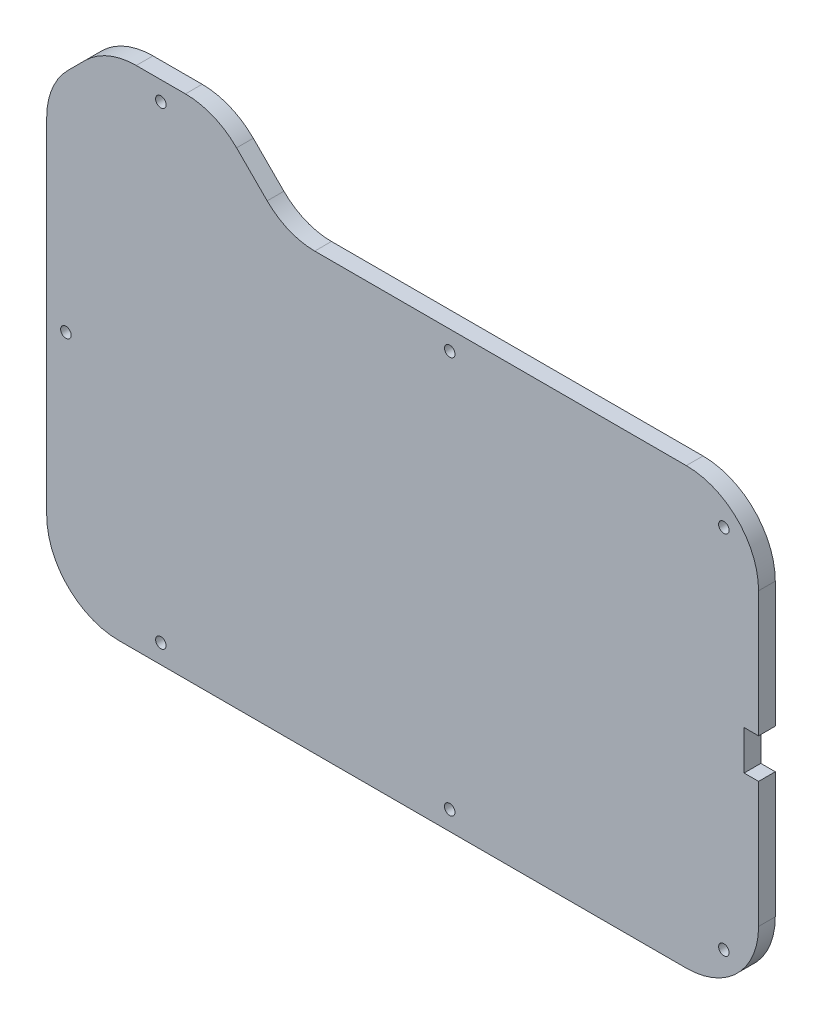
ISO-10303-21;
HEADER;
FILE_DESCRIPTION(('STEP AP214'),'2;1');
FILE_NAME('part.step','',(''),(''),'','','');
FILE_SCHEMA(('AUTOMOTIVE_DESIGN { 1 0 10303 214 1 1 1 1 }'));
ENDSEC;
DATA;
#1=APPLICATION_CONTEXT('core data for automotive mechanical design processes');
#2=APPLICATION_PROTOCOL_DEFINITION('international standard','automotive_design',2000,#1);
#3=PRODUCT_CONTEXT('',#1,'mechanical');
#4=PRODUCT('Part','Part','',(#3));
#5=PRODUCT_RELATED_PRODUCT_CATEGORY('part','',(#4));
#6=PRODUCT_DEFINITION_FORMATION('','',#4);
#7=PRODUCT_DEFINITION_CONTEXT('part definition',#1,'design');
#8=PRODUCT_DEFINITION('design','',#6,#7);
#9=PRODUCT_DEFINITION_SHAPE('','',#8);
#10=(LENGTH_UNIT() NAMED_UNIT(*) SI_UNIT(.MILLI.,.METRE.));
#11=(NAMED_UNIT(*) PLANE_ANGLE_UNIT() SI_UNIT($,.RADIAN.));
#12=(NAMED_UNIT(*) SI_UNIT($,.STERADIAN.) SOLID_ANGLE_UNIT());
#13=UNCERTAINTY_MEASURE_WITH_UNIT(LENGTH_MEASURE(1.E-05),#10,'distance_accuracy_value','');
#14=(GEOMETRIC_REPRESENTATION_CONTEXT(3) GLOBAL_UNCERTAINTY_ASSIGNED_CONTEXT((#13)) GLOBAL_UNIT_ASSIGNED_CONTEXT((#10,
#11,#12)) REPRESENTATION_CONTEXT('',''));
#15=CARTESIAN_POINT('',(0.,0.,0.));
#16=DIRECTION('',(0.,0.,1.));
#17=DIRECTION('',(1.,0.,0.));
#18=AXIS2_PLACEMENT_3D('',#15,#16,#17);
#19=CARTESIAN_POINT('',(130.058069079206,20.4605017386257,3.175));
#20=DIRECTION('',(0.,0.,1.));
#21=DIRECTION('',(1.,0.,0.));
#22=AXIS2_PLACEMENT_3D('',#19,#20,#21);
#23=PLANE('',#22);
#24=CARTESIAN_POINT('',(85.0537427985491,10.3605017396949,3.175));
#25=DIRECTION('',(0.,0.,1.));
#26=DIRECTION('',(1.,0.,0.));
#27=AXIS2_PLACEMENT_3D('',#24,#25,#26);
#28=CIRCLE('',#27,0.999999999999998);
#29=CARTESIAN_POINT('',(86.0537427985491,10.3605017396949,3.175));
#30=VERTEX_POINT('',#29);
#31=EDGE_CURVE('E383',#30,#30,#28,.T.);
#32=ORIENTED_EDGE('',*,*,#31,.F.);
#33=EDGE_LOOP('',(#32));
#34=FACE_BOUND('',#33,.T.);
#35=CARTESIAN_POINT('',(137.199847569466,82.9022802294033,3.175));
#36=DIRECTION('',(0.,0.,1.));
#37=DIRECTION('',(1.,0.,0.));
#38=AXIS2_PLACEMENT_3D('',#35,#36,#37);
#39=CIRCLE('',#38,0.999999999817027);
#40=CARTESIAN_POINT('',(138.199847569283,82.9022802294033,3.175));
#41=VERTEX_POINT('',#40);
#42=EDGE_CURVE('E395',#41,#41,#39,.T.);
#43=ORIENTED_EDGE('',*,*,#42,.F.);
#44=EDGE_LOOP('',(#43));
#45=FACE_BOUND('',#44,.T.);
#46=CARTESIAN_POINT('',(30.0963119397805,99.4605017396949,3.175));
#47=DIRECTION('',(0.,0.,1.));
#48=DIRECTION('',(1.,0.,0.));
#49=AXIS2_PLACEMENT_3D('',#46,#47,#48);
#50=CIRCLE('',#49,0.999999999999998);
#51=CARTESIAN_POINT('',(31.0963119397805,99.4605017396949,3.175));
#52=VERTEX_POINT('',#51);
#53=EDGE_CURVE('E407',#52,#52,#50,.T.);
#54=ORIENTED_EDGE('',*,*,#53,.F.);
#55=EDGE_LOOP('',(#54));
#56=FACE_BOUND('',#55,.T.);
#57=CARTESIAN_POINT('',(130.058069079206,20.4605017386257,3.175));
#58=DIRECTION('',(0.,0.,1.));
#59=DIRECTION('',(1.,0.,0.));
#60=AXIS2_PLACEMENT_3D('',#57,#58,#59);
#61=CIRCLE('',#60,13.75);
#62=CARTESIAN_POINT('',(130.058069079206,6.71050173862571,3.175));
#63=VERTEX_POINT('',#62);
#64=CARTESIAN_POINT('',(143.808069079206,20.4605017386257,3.175));
#65=VERTEX_POINT('',#64);
#66=EDGE_CURVE('E227',#63,#65,#61,.T.);
#67=ORIENTED_EDGE('',*,*,#66,.T.);
#68=DIRECTION('',(0.,1.,0.));
#69=VECTOR('',#68,1.);
#70=CARTESIAN_POINT('',(143.808069079206,20.4605017386257,3.175));
#71=LINE('',#70,#69);
#72=CARTESIAN_POINT('',(143.808069079206,44.3605017391603,3.175));
#73=VERTEX_POINT('',#72);
#74=EDGE_CURVE('E125',#65,#73,#71,.T.);
#75=ORIENTED_EDGE('',*,*,#74,.T.);
#76=DIRECTION('',(-1.,0.,0.));
#77=VECTOR('',#76,1.);
#78=CARTESIAN_POINT('',(141.058069079206,44.3605017391603,3.175));
#79=LINE('',#78,#77);
#80=CARTESIAN_POINT('',(141.058069079206,44.3605017391603,3.175));
#81=VERTEX_POINT('',#80);
#82=EDGE_CURVE('E272',#73,#81,#79,.T.);
#83=ORIENTED_EDGE('',*,*,#82,.T.);
#84=DIRECTION('',(0.,1.,0.));
#85=VECTOR('',#84,1.);
#86=CARTESIAN_POINT('',(141.058069079206,44.3605017391603,3.175));
#87=LINE('',#86,#85);
#88=CARTESIAN_POINT('',(141.058069079206,51.8605017391603,3.175));
#89=VERTEX_POINT('',#88);
#90=EDGE_CURVE('E291',#81,#89,#87,.T.);
#91=ORIENTED_EDGE('',*,*,#90,.T.);
#92=DIRECTION('',(1.,0.,0.));
#93=VECTOR('',#92,1.);
#94=CARTESIAN_POINT('',(141.058069079206,51.8605017391603,3.175));
#95=LINE('',#94,#93);
#96=CARTESIAN_POINT('',(143.808069079206,51.8605017391603,3.175));
#97=VERTEX_POINT('',#96);
#98=EDGE_CURVE('E288',#89,#97,#95,.T.);
#99=ORIENTED_EDGE('',*,*,#98,.T.);
#100=DIRECTION('',(0.,1.,0.));
#101=VECTOR('',#100,1.);
#102=CARTESIAN_POINT('',(143.808069079206,51.8605017391603,3.175));
#103=LINE('',#102,#101);
#104=CARTESIAN_POINT('',(143.808069079206,75.7605017396949,3.175));
#105=VERTEX_POINT('',#104);
#106=EDGE_CURVE('E290',#97,#105,#103,.T.);
#107=ORIENTED_EDGE('',*,*,#106,.T.);
#108=CARTESIAN_POINT('',(130.058069079206,75.7605017396949,3.175));
#109=DIRECTION('',(0.,0.,1.));
#110=DIRECTION('',(1.,0.,0.));
#111=AXIS2_PLACEMENT_3D('',#108,#109,#110);
#112=CIRCLE('',#111,13.75);
#113=CARTESIAN_POINT('',(130.058069079206,89.5105017396949,3.175));
#114=VERTEX_POINT('',#113);
#115=EDGE_CURVE('E293',#105,#114,#112,.T.);
#116=ORIENTED_EDGE('',*,*,#115,.T.);
#117=DIRECTION('',(-1.,0.,0.));
#118=VECTOR('',#117,1.);
#119=CARTESIAN_POINT('',(130.058069079206,89.5105017396948,3.175));
#120=LINE('',#119,#118);
#121=CARTESIAN_POINT('',(59.3751830391429,89.5105017396948,3.175));
#122=VERTEX_POINT('',#121);
#123=EDGE_CURVE('E299',#114,#122,#120,.T.);
#124=ORIENTED_EDGE('',*,*,#123,.T.);
#125=CARTESIAN_POINT('',(59.3751830391429,102.310501739695,3.175));
#126=DIRECTION('',(0.,0.,-1.));
#127=DIRECTION('',(1.,0.,0.));
#128=AXIS2_PLACEMENT_3D('',#125,#126,#127);
#129=CIRCLE('',#128,12.8);
#130=CARTESIAN_POINT('',(50.3242162399551,93.2595349405071,3.175));
#131=VERTEX_POINT('',#130);
#132=EDGE_CURVE('E301',#122,#131,#129,.T.);
#133=ORIENTED_EDGE('',*,*,#132,.T.);
#134=DIRECTION('',(-0.707106781186548,0.707106781186548,0.));
#135=VECTOR('',#134,1.);
#136=CARTESIAN_POINT('',(50.3242162399551,93.2595349405071,3.175));
#137=LINE('',#136,#135);
#138=CARTESIAN_POINT('',(44.5005311994522,99.0832199810099,3.175));
#139=VERTEX_POINT('',#138);
#140=EDGE_CURVE('E303',#131,#139,#137,.T.);
#141=ORIENTED_EDGE('',*,*,#140,.T.);
#142=CARTESIAN_POINT('',(34.7778129581372,89.3605017396949,3.175));
#143=DIRECTION('',(0.,0.,1.));
#144=DIRECTION('',(1.,0.,0.));
#145=AXIS2_PLACEMENT_3D('',#142,#143,#144);
#146=CIRCLE('',#145,13.75);
#147=CARTESIAN_POINT('',(34.7778129581371,103.110501739695,3.175));
#148=VERTEX_POINT('',#147);
#149=EDGE_CURVE('E305',#139,#148,#146,.T.);
#150=ORIENTED_EDGE('',*,*,#149,.T.);
#151=DIRECTION('',(-1.,0.,0.));
#152=VECTOR('',#151,1.);
#153=CARTESIAN_POINT('',(34.7778129581371,103.110501739695,3.175));
#154=LINE('',#153,#152);
#155=CARTESIAN_POINT('',(25.4148109214239,103.110501739695,3.175));
#156=VERTEX_POINT('',#155);
#157=EDGE_CURVE('E307',#148,#156,#154,.T.);
#158=ORIENTED_EDGE('',*,*,#157,.T.);
#159=CARTESIAN_POINT('',(25.4148109214239,89.3605017396949,3.175));
#160=DIRECTION('',(0.,0.,1.));
#161=DIRECTION('',(1.,0.,0.));
#162=AXIS2_PLACEMENT_3D('',#159,#160,#161);
#163=CIRCLE('',#162,13.75);
#164=CARTESIAN_POINT('',(15.6920926801088,99.0832199810099,3.175));
#165=VERTEX_POINT('',#164);
#166=EDGE_CURVE('E309',#156,#165,#163,.T.);
#167=ORIENTED_EDGE('',*,*,#166,.T.);
#168=DIRECTION('',(-0.707106781186548,-0.707106781186548,0.));
#169=VECTOR('',#168,1.);
#170=CARTESIAN_POINT('',(15.6920926801088,99.0832199810099,3.175));
#171=LINE('',#170,#169);
#172=CARTESIAN_POINT('',(12.4118365590397,95.8029638599407,3.175));
#173=VERTEX_POINT('',#172);
#174=EDGE_CURVE('E311',#165,#173,#171,.T.);
#175=ORIENTED_EDGE('',*,*,#174,.T.);
#176=CARTESIAN_POINT('',(22.1345548003547,86.0802456186257,3.175));
#177=DIRECTION('',(0.,0.,1.));
#178=DIRECTION('',(1.,0.,0.));
#179=AXIS2_PLACEMENT_3D('',#176,#177,#178);
#180=CIRCLE('',#179,13.75);
#181=CARTESIAN_POINT('',(8.38455480035474,86.0802456186257,3.175));
#182=VERTEX_POINT('',#181);
#183=EDGE_CURVE('E174',#173,#182,#180,.T.);
#184=ORIENTED_EDGE('',*,*,#183,.T.);
#185=DIRECTION('',(0.,-1.,0.));
#186=VECTOR('',#185,1.);
#187=CARTESIAN_POINT('',(8.38455480035474,86.0802456186257,3.175));
#188=LINE('',#187,#186);
#189=CARTESIAN_POINT('',(8.38455480035472,20.4605017386257,3.175));
#190=VERTEX_POINT('',#189);
#191=EDGE_CURVE('E168',#182,#190,#188,.T.);
#192=ORIENTED_EDGE('',*,*,#191,.T.);
#193=CARTESIAN_POINT('',(22.1345548003547,20.4605017386257,3.175));
#194=DIRECTION('',(0.,0.,1.));
#195=DIRECTION('',(1.,0.,0.));
#196=AXIS2_PLACEMENT_3D('',#193,#194,#195);
#197=CIRCLE('',#196,13.75);
#198=CARTESIAN_POINT('',(22.1345548003547,6.7105017386257,3.175));
#199=VERTEX_POINT('',#198);
#200=EDGE_CURVE('E172',#190,#199,#197,.T.);
#201=ORIENTED_EDGE('',*,*,#200,.T.);
#202=DIRECTION('',(1.,0.,0.));
#203=VECTOR('',#202,1.);
#204=CARTESIAN_POINT('',(22.1345548003547,6.71050173862571,3.175));
#205=LINE('',#204,#203);
#206=EDGE_CURVE('E52',#199,#63,#205,.T.);
#207=ORIENTED_EDGE('',*,*,#206,.T.);
#208=EDGE_LOOP('',(#67,#75,#83,#91,#99,#107,#116,#124,#133,#141,#150,#158,#167,#175,#184,#192,
#201,#207));
#209=FACE_BOUND('',#208,.T.);
#210=CARTESIAN_POINT('',(12.0345548003547,52.4703736791603,3.175));
#211=DIRECTION('',(0.,0.,1.));
#212=DIRECTION('',(1.,0.,0.));
#213=AXIS2_PLACEMENT_3D('',#210,#211,#212);
#214=CIRCLE('',#213,0.999999999999998);
#215=CARTESIAN_POINT('',(13.0345548003547,52.4703736791603,3.175));
#216=VERTEX_POINT('',#215);
#217=EDGE_CURVE('E196',#216,#216,#214,.T.);
#218=ORIENTED_EDGE('',*,*,#217,.F.);
#219=EDGE_LOOP('',(#218));
#220=FACE_BOUND('',#219,.T.);
#221=CARTESIAN_POINT('',(85.0537427985491,85.8605017396949,3.175));
#222=DIRECTION('',(0.,0.,1.));
#223=DIRECTION('',(1.,0.,0.));
#224=AXIS2_PLACEMENT_3D('',#221,#222,#223);
#225=CIRCLE('',#224,0.999999999999998);
#226=CARTESIAN_POINT('',(86.0537427985491,85.8605017396949,3.175));
#227=VERTEX_POINT('',#226);
#228=EDGE_CURVE('E401',#227,#227,#225,.T.);
#229=ORIENTED_EDGE('',*,*,#228,.F.);
#230=EDGE_LOOP('',(#229));
#231=FACE_BOUND('',#230,.T.);
#232=CARTESIAN_POINT('',(137.199847569458,13.3187232494434,3.175));
#233=DIRECTION('',(0.,0.,1.));
#234=DIRECTION('',(1.,0.,0.));
#235=AXIS2_PLACEMENT_3D('',#232,#233,#234);
#236=CIRCLE('',#235,0.999999999822488);
#237=CARTESIAN_POINT('',(138.19984756928,13.3187232494434,3.175));
#238=VERTEX_POINT('',#237);
#239=EDGE_CURVE('E389',#238,#238,#236,.T.);
#240=ORIENTED_EDGE('',*,*,#239,.F.);
#241=EDGE_LOOP('',(#240));
#242=FACE_BOUND('',#241,.T.);
#243=CARTESIAN_POINT('',(30.0963119397805,10.3605017396949,3.175));
#244=DIRECTION('',(0.,0.,1.));
#245=DIRECTION('',(1.,0.,0.));
#246=AXIS2_PLACEMENT_3D('',#243,#244,#245);
#247=CIRCLE('',#246,0.999999999999998);
#248=CARTESIAN_POINT('',(31.0963119397805,10.3605017396949,3.175));
#249=VERTEX_POINT('',#248);
#250=EDGE_CURVE('E374',#249,#249,#247,.T.);
#251=ORIENTED_EDGE('',*,*,#250,.F.);
#252=EDGE_LOOP('',(#251));
#253=FACE_BOUND('',#252,.T.);
#254=ADVANCED_FACE('F35',(#34,#45,#56,#209,#220,#231,#242,#253),#23,.T.);
#255=CARTESIAN_POINT('',(130.058069079206,20.4605017386257,0.));
#256=DIRECTION('',(0.,0.,1.));
#257=DIRECTION('',(1.,0.,0.));
#258=AXIS2_PLACEMENT_3D('',#255,#256,#257);
#259=PLANE('',#258);
#260=CARTESIAN_POINT('',(130.058069079206,20.4605017386257,0.));
#261=DIRECTION('',(0.,0.,1.));
#262=DIRECTION('',(1.,0.,0.));
#263=AXIS2_PLACEMENT_3D('',#260,#261,#262);
#264=CIRCLE('',#263,13.75);
#265=CARTESIAN_POINT('',(130.058069079206,6.71050173862571,0.));
#266=VERTEX_POINT('',#265);
#267=CARTESIAN_POINT('',(143.808069079206,20.4605017386257,0.));
#268=VERTEX_POINT('',#267);
#269=EDGE_CURVE('E192',#266,#268,#264,.T.);
#270=ORIENTED_EDGE('',*,*,#269,.F.);
#271=DIRECTION('',(1.,0.,0.));
#272=VECTOR('',#271,1.);
#273=CARTESIAN_POINT('',(22.1345548003547,6.71050173862571,0.));
#274=LINE('',#273,#272);
#275=CARTESIAN_POINT('',(22.1345548003547,6.7105017386257,0.));
#276=VERTEX_POINT('',#275);
#277=EDGE_CURVE('E117',#276,#266,#274,.T.);
#278=ORIENTED_EDGE('',*,*,#277,.F.);
#279=CARTESIAN_POINT('',(22.1345548003547,20.4605017386257,0.));
#280=DIRECTION('',(0.,0.,1.));
#281=DIRECTION('',(1.,0.,0.));
#282=AXIS2_PLACEMENT_3D('',#279,#280,#281);
#283=CIRCLE('',#282,13.75);
#284=CARTESIAN_POINT('',(8.38455480035472,20.4605017386257,0.));
#285=VERTEX_POINT('',#284);
#286=EDGE_CURVE('E111',#285,#276,#283,.T.);
#287=ORIENTED_EDGE('',*,*,#286,.F.);
#288=DIRECTION('',(0.,-1.,0.));
#289=VECTOR('',#288,1.);
#290=CARTESIAN_POINT('',(8.38455480035474,86.0802456186257,0.));
#291=LINE('',#290,#289);
#292=CARTESIAN_POINT('',(8.38455480035474,86.0802456186257,0.));
#293=VERTEX_POINT('',#292);
#294=EDGE_CURVE('E182',#293,#285,#291,.T.);
#295=ORIENTED_EDGE('',*,*,#294,.F.);
#296=CARTESIAN_POINT('',(22.1345548003547,86.0802456186257,0.));
#297=DIRECTION('',(0.,0.,1.));
#298=DIRECTION('',(1.,0.,0.));
#299=AXIS2_PLACEMENT_3D('',#296,#297,#298);
#300=CIRCLE('',#299,13.75);
#301=CARTESIAN_POINT('',(12.4118365590397,95.8029638599407,0.));
#302=VERTEX_POINT('',#301);
#303=EDGE_CURVE('E222',#302,#293,#300,.T.);
#304=ORIENTED_EDGE('',*,*,#303,.F.);
#305=DIRECTION('',(-0.707106781186548,-0.707106781186548,0.));
#306=VECTOR('',#305,1.);
#307=CARTESIAN_POINT('',(15.6920926801088,99.0832199810099,0.));
#308=LINE('',#307,#306);
#309=CARTESIAN_POINT('',(15.6920926801088,99.0832199810099,0.));
#310=VERTEX_POINT('',#309);
#311=EDGE_CURVE('E220',#310,#302,#308,.T.);
#312=ORIENTED_EDGE('',*,*,#311,.F.);
#313=CARTESIAN_POINT('',(25.4148109214239,89.3605017396949,0.));
#314=DIRECTION('',(0.,0.,1.));
#315=DIRECTION('',(1.,0.,0.));
#316=AXIS2_PLACEMENT_3D('',#313,#314,#315);
#317=CIRCLE('',#316,13.75);
#318=CARTESIAN_POINT('',(25.4148109214239,103.110501739695,0.));
#319=VERTEX_POINT('',#318);
#320=EDGE_CURVE('E218',#319,#310,#317,.T.);
#321=ORIENTED_EDGE('',*,*,#320,.F.);
#322=DIRECTION('',(-1.,0.,0.));
#323=VECTOR('',#322,1.);
#324=CARTESIAN_POINT('',(34.7778129581371,103.110501739695,0.));
#325=LINE('',#324,#323);
#326=CARTESIAN_POINT('',(34.7778129581371,103.110501739695,0.));
#327=VERTEX_POINT('',#326);
#328=EDGE_CURVE('E216',#327,#319,#325,.T.);
#329=ORIENTED_EDGE('',*,*,#328,.F.);
#330=CARTESIAN_POINT('',(34.7778129581372,89.3605017396949,0.));
#331=DIRECTION('',(0.,0.,1.));
#332=DIRECTION('',(1.,0.,0.));
#333=AXIS2_PLACEMENT_3D('',#330,#331,#332);
#334=CIRCLE('',#333,13.75);
#335=CARTESIAN_POINT('',(44.5005311994522,99.0832199810099,0.));
#336=VERTEX_POINT('',#335);
#337=EDGE_CURVE('E214',#336,#327,#334,.T.);
#338=ORIENTED_EDGE('',*,*,#337,.F.);
#339=DIRECTION('',(-0.707106781186548,0.707106781186548,0.));
#340=VECTOR('',#339,1.);
#341=CARTESIAN_POINT('',(50.3242162399551,93.2595349405071,0.));
#342=LINE('',#341,#340);
#343=CARTESIAN_POINT('',(50.3242162399551,93.2595349405071,0.));
#344=VERTEX_POINT('',#343);
#345=EDGE_CURVE('E212',#344,#336,#342,.T.);
#346=ORIENTED_EDGE('',*,*,#345,.F.);
#347=CARTESIAN_POINT('',(59.3751830391429,102.310501739695,0.));
#348=DIRECTION('',(0.,0.,-1.));
#349=DIRECTION('',(1.,0.,0.));
#350=AXIS2_PLACEMENT_3D('',#347,#348,#349);
#351=CIRCLE('',#350,12.8);
#352=CARTESIAN_POINT('',(59.3751830391429,89.5105017396948,0.));
#353=VERTEX_POINT('',#352);
#354=EDGE_CURVE('E210',#353,#344,#351,.T.);
#355=ORIENTED_EDGE('',*,*,#354,.F.);
#356=DIRECTION('',(-1.,0.,0.));
#357=VECTOR('',#356,1.);
#358=CARTESIAN_POINT('',(130.058069079206,89.5105017396948,0.));
#359=LINE('',#358,#357);
#360=CARTESIAN_POINT('',(130.058069079206,89.5105017396949,0.));
#361=VERTEX_POINT('',#360);
#362=EDGE_CURVE('E208',#361,#353,#359,.T.);
#363=ORIENTED_EDGE('',*,*,#362,.F.);
#364=CARTESIAN_POINT('',(130.058069079206,75.7605017396949,0.));
#365=DIRECTION('',(0.,0.,1.));
#366=DIRECTION('',(1.,0.,0.));
#367=AXIS2_PLACEMENT_3D('',#364,#365,#366);
#368=CIRCLE('',#367,13.75);
#369=CARTESIAN_POINT('',(143.808069079206,75.7605017396949,0.));
#370=VERTEX_POINT('',#369);
#371=EDGE_CURVE('E206',#370,#361,#368,.T.);
#372=ORIENTED_EDGE('',*,*,#371,.F.);
#373=DIRECTION('',(0.,1.,0.));
#374=VECTOR('',#373,1.);
#375=CARTESIAN_POINT('',(143.808069079206,51.8605017391603,0.));
#376=LINE('',#375,#374);
#377=CARTESIAN_POINT('',(143.808069079206,51.8605017391603,0.));
#378=VERTEX_POINT('',#377);
#379=EDGE_CURVE('E204',#378,#370,#376,.T.);
#380=ORIENTED_EDGE('',*,*,#379,.F.);
#381=DIRECTION('',(1.,0.,0.));
#382=VECTOR('',#381,1.);
#383=CARTESIAN_POINT('',(141.058069079206,51.8605017391603,0.));
#384=LINE('',#383,#382);
#385=CARTESIAN_POINT('',(141.058069079206,51.8605017391603,0.));
#386=VERTEX_POINT('',#385);
#387=EDGE_CURVE('E202',#386,#378,#384,.T.);
#388=ORIENTED_EDGE('',*,*,#387,.F.);
#389=DIRECTION('',(0.,1.,0.));
#390=VECTOR('',#389,1.);
#391=CARTESIAN_POINT('',(141.058069079206,44.3605017391603,0.));
#392=LINE('',#391,#390);
#393=CARTESIAN_POINT('',(141.058069079206,44.3605017391603,0.));
#394=VERTEX_POINT('',#393);
#395=EDGE_CURVE('E200',#394,#386,#392,.T.);
#396=ORIENTED_EDGE('',*,*,#395,.F.);
#397=DIRECTION('',(-1.,0.,0.));
#398=VECTOR('',#397,1.);
#399=CARTESIAN_POINT('',(141.058069079206,44.3605017391603,0.));
#400=LINE('',#399,#398);
#401=CARTESIAN_POINT('',(143.808069079206,44.3605017391603,0.));
#402=VERTEX_POINT('',#401);
#403=EDGE_CURVE('E198',#402,#394,#400,.T.);
#404=ORIENTED_EDGE('',*,*,#403,.F.);
#405=DIRECTION('',(0.,1.,0.));
#406=VECTOR('',#405,1.);
#407=CARTESIAN_POINT('',(143.808069079206,20.4605017386257,0.));
#408=LINE('',#407,#406);
#409=EDGE_CURVE('E195',#268,#402,#408,.T.);
#410=ORIENTED_EDGE('',*,*,#409,.F.);
#411=EDGE_LOOP('',(#270,#278,#287,#295,#304,#312,#321,#329,#338,#346,#355,#363,#372,#380,#388,
#396,#404,#410));
#412=FACE_BOUND('',#411,.T.);
#413=CARTESIAN_POINT('',(12.0345548003547,52.4703736791603,0.));
#414=DIRECTION('',(0.,0.,1.));
#415=DIRECTION('',(1.,0.,0.));
#416=AXIS2_PLACEMENT_3D('',#413,#414,#415);
#417=CIRCLE('',#416,0.999999999999998);
#418=CARTESIAN_POINT('',(13.0345548003547,52.4703736791603,0.));
#419=VERTEX_POINT('',#418);
#420=EDGE_CURVE('E410',#419,#419,#417,.T.);
#421=ORIENTED_EDGE('',*,*,#420,.T.);
#422=EDGE_LOOP('',(#421));
#423=FACE_BOUND('',#422,.T.);
#424=CARTESIAN_POINT('',(30.0963119397805,99.4605017396949,0.));
#425=DIRECTION('',(0.,0.,1.));
#426=DIRECTION('',(1.,0.,0.));
#427=AXIS2_PLACEMENT_3D('',#424,#425,#426);
#428=CIRCLE('',#427,0.999999999999998);
#429=CARTESIAN_POINT('',(31.0963119397805,99.4605017396949,0.));
#430=VERTEX_POINT('',#429);
#431=EDGE_CURVE('E404',#430,#430,#428,.T.);
#432=ORIENTED_EDGE('',*,*,#431,.T.);
#433=EDGE_LOOP('',(#432));
#434=FACE_BOUND('',#433,.T.);
#435=CARTESIAN_POINT('',(85.0537427985491,85.8605017396949,0.));
#436=DIRECTION('',(0.,0.,1.));
#437=DIRECTION('',(1.,0.,0.));
#438=AXIS2_PLACEMENT_3D('',#435,#436,#437);
#439=CIRCLE('',#438,0.999999999999998);
#440=CARTESIAN_POINT('',(86.0537427985491,85.8605017396949,0.));
#441=VERTEX_POINT('',#440);
#442=EDGE_CURVE('E398',#441,#441,#439,.T.);
#443=ORIENTED_EDGE('',*,*,#442,.T.);
#444=EDGE_LOOP('',(#443));
#445=FACE_BOUND('',#444,.T.);
#446=CARTESIAN_POINT('',(137.199847569466,82.9022802294033,0.));
#447=DIRECTION('',(0.,0.,1.));
#448=DIRECTION('',(1.,0.,0.));
#449=AXIS2_PLACEMENT_3D('',#446,#447,#448);
#450=CIRCLE('',#449,0.999999999817027);
#451=CARTESIAN_POINT('',(138.199847569283,82.9022802294033,0.));
#452=VERTEX_POINT('',#451);
#453=EDGE_CURVE('E392',#452,#452,#450,.T.);
#454=ORIENTED_EDGE('',*,*,#453,.T.);
#455=EDGE_LOOP('',(#454));
#456=FACE_BOUND('',#455,.T.);
#457=CARTESIAN_POINT('',(137.199847569458,13.3187232494434,0.));
#458=DIRECTION('',(0.,0.,1.));
#459=DIRECTION('',(1.,0.,0.));
#460=AXIS2_PLACEMENT_3D('',#457,#458,#459);
#461=CIRCLE('',#460,0.999999999822488);
#462=CARTESIAN_POINT('',(138.19984756928,13.3187232494434,0.));
#463=VERTEX_POINT('',#462);
#464=EDGE_CURVE('E386',#463,#463,#461,.T.);
#465=ORIENTED_EDGE('',*,*,#464,.T.);
#466=EDGE_LOOP('',(#465));
#467=FACE_BOUND('',#466,.T.);
#468=CARTESIAN_POINT('',(85.0537427985491,10.3605017396949,0.));
#469=DIRECTION('',(0.,0.,1.));
#470=DIRECTION('',(1.,0.,0.));
#471=AXIS2_PLACEMENT_3D('',#468,#469,#470);
#472=CIRCLE('',#471,0.999999999999998);
#473=CARTESIAN_POINT('',(86.0537427985491,10.3605017396949,0.));
#474=VERTEX_POINT('',#473);
#475=EDGE_CURVE('E380',#474,#474,#472,.T.);
#476=ORIENTED_EDGE('',*,*,#475,.T.);
#477=EDGE_LOOP('',(#476));
#478=FACE_BOUND('',#477,.T.);
#479=CARTESIAN_POINT('',(30.0963119397805,10.3605017396949,0.));
#480=DIRECTION('',(0.,0.,1.));
#481=DIRECTION('',(1.,0.,0.));
#482=AXIS2_PLACEMENT_3D('',#479,#480,#481);
#483=CIRCLE('',#482,0.999999999999998);
#484=CARTESIAN_POINT('',(31.0963119397805,10.3605017396949,0.));
#485=VERTEX_POINT('',#484);
#486=EDGE_CURVE('E377',#485,#485,#483,.T.);
#487=ORIENTED_EDGE('',*,*,#486,.T.);
#488=EDGE_LOOP('',(#487));
#489=FACE_BOUND('',#488,.T.);
#490=ADVANCED_FACE('F276',(#412,#423,#434,#445,#456,#467,#478,#489),#259,.F.);
#491=CARTESIAN_POINT('',(130.058069079206,20.4605017386257,3.175));
#492=DIRECTION('',(0.,0.,-1.));
#493=DIRECTION('',(-1.,0.,0.));
#494=AXIS2_PLACEMENT_3D('',#491,#492,#493);
#495=CYLINDRICAL_SURFACE('',#494,13.75);
#496=ORIENTED_EDGE('',*,*,#269,.T.);
#497=DIRECTION('',(0.,0.,-1.));
#498=VECTOR('',#497,1.);
#499=CARTESIAN_POINT('',(143.808069079206,20.4605017386257,3.175));
#500=LINE('',#499,#498);
#501=EDGE_CURVE('E11',#65,#268,#500,.T.);
#502=ORIENTED_EDGE('',*,*,#501,.F.);
#503=ORIENTED_EDGE('',*,*,#66,.F.);
#504=DIRECTION('',(0.,0.,-1.));
#505=VECTOR('',#504,1.);
#506=CARTESIAN_POINT('',(130.058069079206,6.71050173862571,3.175));
#507=LINE('',#506,#505);
#508=EDGE_CURVE('E188',#63,#266,#507,.T.);
#509=ORIENTED_EDGE('',*,*,#508,.T.);
#510=EDGE_LOOP('',(#496,#502,#503,#509));
#511=FACE_BOUND('',#510,.T.);
#512=ADVANCED_FACE('F37',(#511),#495,.T.);
#513=CARTESIAN_POINT('',(143.808069079206,20.4605017386257,3.175));
#514=DIRECTION('',(-1.,0.,0.));
#515=DIRECTION('',(0.,0.,1.));
#516=AXIS2_PLACEMENT_3D('',#513,#514,#515);
#517=PLANE('',#516);
#518=ORIENTED_EDGE('',*,*,#409,.T.);
#519=DIRECTION('',(0.,0.,-1.));
#520=VECTOR('',#519,1.);
#521=CARTESIAN_POINT('',(143.808069079206,44.3605017391603,3.175));
#522=LINE('',#521,#520);
#523=EDGE_CURVE('E44',#73,#402,#522,.T.);
#524=ORIENTED_EDGE('',*,*,#523,.F.);
#525=ORIENTED_EDGE('',*,*,#74,.F.);
#526=ORIENTED_EDGE('',*,*,#501,.T.);
#527=EDGE_LOOP('',(#518,#524,#525,#526));
#528=FACE_BOUND('',#527,.T.);
#529=ADVANCED_FACE('F607',(#528),#517,.F.);
#530=CARTESIAN_POINT('',(141.058069079206,44.3605017391603,3.175));
#531=DIRECTION('',(0.,-1.,0.));
#532=DIRECTION('',(0.,0.,-1.));
#533=AXIS2_PLACEMENT_3D('',#530,#531,#532);
#534=PLANE('',#533);
#535=ORIENTED_EDGE('',*,*,#403,.T.);
#536=DIRECTION('',(0.,0.,-1.));
#537=VECTOR('',#536,1.);
#538=CARTESIAN_POINT('',(141.058069079206,44.3605017391603,3.175));
#539=LINE('',#538,#537);
#540=EDGE_CURVE('E264',#81,#394,#539,.T.);
#541=ORIENTED_EDGE('',*,*,#540,.F.);
#542=ORIENTED_EDGE('',*,*,#82,.F.);
#543=ORIENTED_EDGE('',*,*,#523,.T.);
#544=EDGE_LOOP('',(#535,#541,#542,#543));
#545=FACE_BOUND('',#544,.T.);
#546=ADVANCED_FACE('F270',(#545),#534,.F.);
#547=CARTESIAN_POINT('',(141.058069079206,44.3605017391603,3.175));
#548=DIRECTION('',(-1.,0.,0.));
#549=DIRECTION('',(0.,0.,1.));
#550=AXIS2_PLACEMENT_3D('',#547,#548,#549);
#551=PLANE('',#550);
#552=ORIENTED_EDGE('',*,*,#395,.T.);
#553=DIRECTION('',(0.,0.,-1.));
#554=VECTOR('',#553,1.);
#555=CARTESIAN_POINT('',(141.058069079206,51.8605017391603,3.175));
#556=LINE('',#555,#554);
#557=EDGE_CURVE('E261',#89,#386,#556,.T.);
#558=ORIENTED_EDGE('',*,*,#557,.F.);
#559=ORIENTED_EDGE('',*,*,#90,.F.);
#560=ORIENTED_EDGE('',*,*,#540,.T.);
#561=EDGE_LOOP('',(#552,#558,#559,#560));
#562=FACE_BOUND('',#561,.T.);
#563=ADVANCED_FACE('F282',(#562),#551,.F.);
#564=CARTESIAN_POINT('',(141.058069079206,51.8605017391603,3.175));
#565=DIRECTION('',(0.,1.,0.));
#566=DIRECTION('',(0.,0.,1.));
#567=AXIS2_PLACEMENT_3D('',#564,#565,#566);
#568=PLANE('',#567);
#569=ORIENTED_EDGE('',*,*,#387,.T.);
#570=DIRECTION('',(0.,0.,-1.));
#571=VECTOR('',#570,1.);
#572=CARTESIAN_POINT('',(143.808069079206,51.8605017391603,3.175));
#573=LINE('',#572,#571);
#574=EDGE_CURVE('E258',#97,#378,#573,.T.);
#575=ORIENTED_EDGE('',*,*,#574,.F.);
#576=ORIENTED_EDGE('',*,*,#98,.F.);
#577=ORIENTED_EDGE('',*,*,#557,.T.);
#578=EDGE_LOOP('',(#569,#575,#576,#577));
#579=FACE_BOUND('',#578,.T.);
#580=ADVANCED_FACE('F286',(#579),#568,.F.);
#581=CARTESIAN_POINT('',(143.808069079206,51.8605017391603,3.175));
#582=DIRECTION('',(-1.,0.,0.));
#583=DIRECTION('',(0.,0.,1.));
#584=AXIS2_PLACEMENT_3D('',#581,#582,#583);
#585=PLANE('',#584);
#586=ORIENTED_EDGE('',*,*,#379,.T.);
#587=DIRECTION('',(0.,0.,-1.));
#588=VECTOR('',#587,1.);
#589=CARTESIAN_POINT('',(143.808069079206,75.7605017396949,3.175));
#590=LINE('',#589,#588);
#591=EDGE_CURVE('E255',#105,#370,#590,.T.);
#592=ORIENTED_EDGE('',*,*,#591,.F.);
#593=ORIENTED_EDGE('',*,*,#106,.F.);
#594=ORIENTED_EDGE('',*,*,#574,.T.);
#595=EDGE_LOOP('',(#586,#592,#593,#594));
#596=FACE_BOUND('',#595,.T.);
#597=ADVANCED_FACE('F572',(#596),#585,.F.);
#598=CARTESIAN_POINT('',(130.058069079206,75.7605017396949,3.175));
#599=DIRECTION('',(0.,0.,-1.));
#600=DIRECTION('',(-1.,0.,0.));
#601=AXIS2_PLACEMENT_3D('',#598,#599,#600);
#602=CYLINDRICAL_SURFACE('',#601,13.75);
#603=ORIENTED_EDGE('',*,*,#371,.T.);
#604=DIRECTION('',(0.,0.,-1.));
#605=VECTOR('',#604,1.);
#606=CARTESIAN_POINT('',(130.058069079206,89.5105017396949,3.175));
#607=LINE('',#606,#605);
#608=EDGE_CURVE('E252',#114,#361,#607,.T.);
#609=ORIENTED_EDGE('',*,*,#608,.F.);
#610=ORIENTED_EDGE('',*,*,#115,.F.);
#611=ORIENTED_EDGE('',*,*,#591,.T.);
#612=EDGE_LOOP('',(#603,#609,#610,#611));
#613=FACE_BOUND('',#612,.T.);
#614=ADVANCED_FACE('F562',(#613),#602,.T.);
#615=CARTESIAN_POINT('',(130.058069079206,89.5105017396948,3.175));
#616=DIRECTION('',(0.,-1.,0.));
#617=DIRECTION('',(0.,0.,-1.));
#618=AXIS2_PLACEMENT_3D('',#615,#616,#617);
#619=PLANE('',#618);
#620=ORIENTED_EDGE('',*,*,#362,.T.);
#621=DIRECTION('',(0.,0.,-1.));
#622=VECTOR('',#621,1.);
#623=CARTESIAN_POINT('',(59.3751830391429,89.5105017396948,3.175));
#624=LINE('',#623,#622);
#625=EDGE_CURVE('E249',#122,#353,#624,.T.);
#626=ORIENTED_EDGE('',*,*,#625,.F.);
#627=ORIENTED_EDGE('',*,*,#123,.F.);
#628=ORIENTED_EDGE('',*,*,#608,.T.);
#629=EDGE_LOOP('',(#620,#626,#627,#628));
#630=FACE_BOUND('',#629,.T.);
#631=ADVANCED_FACE('F552',(#630),#619,.F.);
#632=CARTESIAN_POINT('',(59.3751830391429,102.310501739695,3.175));
#633=DIRECTION('',(0.,0.,-1.));
#634=DIRECTION('',(-1.,0.,0.));
#635=AXIS2_PLACEMENT_3D('',#632,#633,#634);
#636=CYLINDRICAL_SURFACE('',#635,12.8);
#637=ORIENTED_EDGE('',*,*,#354,.T.);
#638=DIRECTION('',(0.,0.,-1.));
#639=VECTOR('',#638,1.);
#640=CARTESIAN_POINT('',(50.3242162399551,93.2595349405071,3.175));
#641=LINE('',#640,#639);
#642=EDGE_CURVE('E246',#131,#344,#641,.T.);
#643=ORIENTED_EDGE('',*,*,#642,.F.);
#644=ORIENTED_EDGE('',*,*,#132,.F.);
#645=ORIENTED_EDGE('',*,*,#625,.T.);
#646=EDGE_LOOP('',(#637,#643,#644,#645));
#647=FACE_BOUND('',#646,.T.);
#648=ADVANCED_FACE('F542',(#647),#636,.F.);
#649=CARTESIAN_POINT('',(50.3242162399551,93.2595349405071,3.175));
#650=DIRECTION('',(-0.707106781186548,-0.707106781186548,0.));
#651=DIRECTION('',(0.707106781186548,-0.707106781186548,0.));
#652=AXIS2_PLACEMENT_3D('',#649,#650,#651);
#653=PLANE('',#652);
#654=ORIENTED_EDGE('',*,*,#345,.T.);
#655=DIRECTION('',(0.,0.,-1.));
#656=VECTOR('',#655,1.);
#657=CARTESIAN_POINT('',(44.5005311994522,99.0832199810099,3.175));
#658=LINE('',#657,#656);
#659=EDGE_CURVE('E243',#139,#336,#658,.T.);
#660=ORIENTED_EDGE('',*,*,#659,.F.);
#661=ORIENTED_EDGE('',*,*,#140,.F.);
#662=ORIENTED_EDGE('',*,*,#642,.T.);
#663=EDGE_LOOP('',(#654,#660,#661,#662));
#664=FACE_BOUND('',#663,.T.);
#665=ADVANCED_FACE('F532',(#664),#653,.F.);
#666=CARTESIAN_POINT('',(34.7778129581372,89.3605017396949,3.175));
#667=DIRECTION('',(0.,0.,-1.));
#668=DIRECTION('',(-1.,0.,0.));
#669=AXIS2_PLACEMENT_3D('',#666,#667,#668);
#670=CYLINDRICAL_SURFACE('',#669,13.75);
#671=ORIENTED_EDGE('',*,*,#337,.T.);
#672=DIRECTION('',(0.,0.,-1.));
#673=VECTOR('',#672,1.);
#674=CARTESIAN_POINT('',(34.7778129581371,103.110501739695,3.175));
#675=LINE('',#674,#673);
#676=EDGE_CURVE('E240',#148,#327,#675,.T.);
#677=ORIENTED_EDGE('',*,*,#676,.F.);
#678=ORIENTED_EDGE('',*,*,#149,.F.);
#679=ORIENTED_EDGE('',*,*,#659,.T.);
#680=EDGE_LOOP('',(#671,#677,#678,#679));
#681=FACE_BOUND('',#680,.T.);
#682=ADVANCED_FACE('F522',(#681),#670,.T.);
#683=CARTESIAN_POINT('',(34.7778129581371,103.110501739695,3.175));
#684=DIRECTION('',(0.,-1.,0.));
#685=DIRECTION('',(0.,0.,-1.));
#686=AXIS2_PLACEMENT_3D('',#683,#684,#685);
#687=PLANE('',#686);
#688=ORIENTED_EDGE('',*,*,#328,.T.);
#689=DIRECTION('',(0.,0.,-1.));
#690=VECTOR('',#689,1.);
#691=CARTESIAN_POINT('',(25.4148109214239,103.110501739695,3.175));
#692=LINE('',#691,#690);
#693=EDGE_CURVE('E237',#156,#319,#692,.T.);
#694=ORIENTED_EDGE('',*,*,#693,.F.);
#695=ORIENTED_EDGE('',*,*,#157,.F.);
#696=ORIENTED_EDGE('',*,*,#676,.T.);
#697=EDGE_LOOP('',(#688,#694,#695,#696));
#698=FACE_BOUND('',#697,.T.);
#699=ADVANCED_FACE('F512',(#698),#687,.F.);
#700=CARTESIAN_POINT('',(25.4148109214239,89.3605017396949,3.175));
#701=DIRECTION('',(0.,0.,-1.));
#702=DIRECTION('',(-1.,0.,0.));
#703=AXIS2_PLACEMENT_3D('',#700,#701,#702);
#704=CYLINDRICAL_SURFACE('',#703,13.75);
#705=ORIENTED_EDGE('',*,*,#320,.T.);
#706=DIRECTION('',(0.,0.,-1.));
#707=VECTOR('',#706,1.);
#708=CARTESIAN_POINT('',(15.6920926801088,99.0832199810099,3.175));
#709=LINE('',#708,#707);
#710=EDGE_CURVE('E234',#165,#310,#709,.T.);
#711=ORIENTED_EDGE('',*,*,#710,.F.);
#712=ORIENTED_EDGE('',*,*,#166,.F.);
#713=ORIENTED_EDGE('',*,*,#693,.T.);
#714=EDGE_LOOP('',(#705,#711,#712,#713));
#715=FACE_BOUND('',#714,.T.);
#716=ADVANCED_FACE('F503',(#715),#704,.T.);
#717=CARTESIAN_POINT('',(15.6920926801088,99.0832199810099,3.175));
#718=DIRECTION('',(0.707106781186548,-0.707106781186548,0.));
#719=DIRECTION('',(0.707106781186548,0.707106781186548,0.));
#720=AXIS2_PLACEMENT_3D('',#717,#718,#719);
#721=PLANE('',#720);
#722=ORIENTED_EDGE('',*,*,#311,.T.);
#723=DIRECTION('',(0.,0.,-1.));
#724=VECTOR('',#723,1.);
#725=CARTESIAN_POINT('',(12.4118365590397,95.8029638599407,3.175));
#726=LINE('',#725,#724);
#727=EDGE_CURVE('E231',#173,#302,#726,.T.);
#728=ORIENTED_EDGE('',*,*,#727,.F.);
#729=ORIENTED_EDGE('',*,*,#174,.F.);
#730=ORIENTED_EDGE('',*,*,#710,.T.);
#731=EDGE_LOOP('',(#722,#728,#729,#730));
#732=FACE_BOUND('',#731,.T.);
#733=ADVANCED_FACE('F317',(#732),#721,.F.);
#734=CARTESIAN_POINT('',(22.1345548003547,86.0802456186257,3.175));
#735=DIRECTION('',(0.,0.,-1.));
#736=DIRECTION('',(-1.,0.,0.));
#737=AXIS2_PLACEMENT_3D('',#734,#735,#736);
#738=CYLINDRICAL_SURFACE('',#737,13.75);
#739=ORIENTED_EDGE('',*,*,#303,.T.);
#740=DIRECTION('',(0.,0.,-1.));
#741=VECTOR('',#740,1.);
#742=CARTESIAN_POINT('',(8.38455480035474,86.0802456186257,3.175));
#743=LINE('',#742,#741);
#744=EDGE_CURVE('E183',#182,#293,#743,.T.);
#745=ORIENTED_EDGE('',*,*,#744,.F.);
#746=ORIENTED_EDGE('',*,*,#183,.F.);
#747=ORIENTED_EDGE('',*,*,#727,.T.);
#748=EDGE_LOOP('',(#739,#745,#746,#747));
#749=FACE_BOUND('',#748,.T.);
#750=ADVANCED_FACE('F321',(#749),#738,.T.);
#751=CARTESIAN_POINT('',(8.38455480035474,86.0802456186257,3.175));
#752=DIRECTION('',(1.,0.,0.));
#753=DIRECTION('',(0.,1.,0.));
#754=AXIS2_PLACEMENT_3D('',#751,#752,#753);
#755=PLANE('',#754);
#756=ORIENTED_EDGE('',*,*,#294,.T.);
#757=DIRECTION('',(0.,0.,-1.));
#758=VECTOR('',#757,1.);
#759=CARTESIAN_POINT('',(8.38455480035472,20.4605017386257,3.175));
#760=LINE('',#759,#758);
#761=EDGE_CURVE('E179',#190,#285,#760,.T.);
#762=ORIENTED_EDGE('',*,*,#761,.F.);
#763=ORIENTED_EDGE('',*,*,#191,.F.);
#764=ORIENTED_EDGE('',*,*,#744,.T.);
#765=EDGE_LOOP('',(#756,#762,#763,#764));
#766=FACE_BOUND('',#765,.T.);
#767=ADVANCED_FACE('F180',(#766),#755,.F.);
#768=CARTESIAN_POINT('',(22.1345548003547,20.4605017386257,3.175));
#769=DIRECTION('',(0.,0.,-1.));
#770=DIRECTION('',(-1.,0.,0.));
#771=AXIS2_PLACEMENT_3D('',#768,#769,#770);
#772=CYLINDRICAL_SURFACE('',#771,13.75);
#773=ORIENTED_EDGE('',*,*,#286,.T.);
#774=DIRECTION('',(0.,0.,-1.));
#775=VECTOR('',#774,1.);
#776=CARTESIAN_POINT('',(22.1345548003547,6.7105017386257,3.175));
#777=LINE('',#776,#775);
#778=EDGE_CURVE('E184',#199,#276,#777,.T.);
#779=ORIENTED_EDGE('',*,*,#778,.F.);
#780=ORIENTED_EDGE('',*,*,#200,.F.);
#781=ORIENTED_EDGE('',*,*,#761,.T.);
#782=EDGE_LOOP('',(#773,#779,#780,#781));
#783=FACE_BOUND('',#782,.T.);
#784=ADVANCED_FACE('F186',(#783),#772,.T.);
#785=CARTESIAN_POINT('',(22.1345548003547,6.71050173862571,3.175));
#786=DIRECTION('',(0.,1.,0.));
#787=DIRECTION('',(0.,0.,1.));
#788=AXIS2_PLACEMENT_3D('',#785,#786,#787);
#789=PLANE('',#788);
#790=ORIENTED_EDGE('',*,*,#277,.T.);
#791=ORIENTED_EDGE('',*,*,#508,.F.);
#792=ORIENTED_EDGE('',*,*,#206,.F.);
#793=ORIENTED_EDGE('',*,*,#778,.T.);
#794=EDGE_LOOP('',(#790,#791,#792,#793));
#795=FACE_BOUND('',#794,.T.);
#796=ADVANCED_FACE('F325',(#795),#789,.F.);
#797=CARTESIAN_POINT('',(12.0345548003547,52.4703736791603,3.175));
#798=DIRECTION('',(0.,0.,-1.));
#799=DIRECTION('',(-1.,0.,0.));
#800=AXIS2_PLACEMENT_3D('',#797,#798,#799);
#801=CYLINDRICAL_SURFACE('',#800,0.999999999999998);
#802=ORIENTED_EDGE('',*,*,#217,.T.);
#803=EDGE_LOOP('',(#802));
#804=FACE_BOUND('',#803,.T.);
#805=ORIENTED_EDGE('',*,*,#420,.F.);
#806=EDGE_LOOP('',(#805));
#807=FACE_BOUND('',#806,.T.);
#808=ADVANCED_FACE('F327',(#804,#807),#801,.F.);
#809=CARTESIAN_POINT('',(30.0963119397805,99.4605017396949,3.175));
#810=DIRECTION('',(0.,0.,-1.));
#811=DIRECTION('',(-1.,0.,0.));
#812=AXIS2_PLACEMENT_3D('',#809,#810,#811);
#813=CYLINDRICAL_SURFACE('',#812,0.999999999999998);
#814=ORIENTED_EDGE('',*,*,#53,.T.);
#815=EDGE_LOOP('',(#814));
#816=FACE_BOUND('',#815,.T.);
#817=ORIENTED_EDGE('',*,*,#431,.F.);
#818=EDGE_LOOP('',(#817));
#819=FACE_BOUND('',#818,.T.);
#820=ADVANCED_FACE('F333',(#816,#819),#813,.F.);
#821=CARTESIAN_POINT('',(85.0537427985491,85.8605017396949,3.175));
#822=DIRECTION('',(0.,0.,-1.));
#823=DIRECTION('',(-1.,0.,0.));
#824=AXIS2_PLACEMENT_3D('',#821,#822,#823);
#825=CYLINDRICAL_SURFACE('',#824,0.999999999999998);
#826=ORIENTED_EDGE('',*,*,#228,.T.);
#827=EDGE_LOOP('',(#826));
#828=FACE_BOUND('',#827,.T.);
#829=ORIENTED_EDGE('',*,*,#442,.F.);
#830=EDGE_LOOP('',(#829));
#831=FACE_BOUND('',#830,.T.);
#832=ADVANCED_FACE('F349',(#828,#831),#825,.F.);
#833=CARTESIAN_POINT('',(137.199847569466,82.9022802294033,3.175));
#834=DIRECTION('',(0.,0.,-1.));
#835=DIRECTION('',(-1.,0.,0.));
#836=AXIS2_PLACEMENT_3D('',#833,#834,#835);
#837=CYLINDRICAL_SURFACE('',#836,0.999999999817027);
#838=ORIENTED_EDGE('',*,*,#42,.T.);
#839=EDGE_LOOP('',(#838));
#840=FACE_BOUND('',#839,.T.);
#841=ORIENTED_EDGE('',*,*,#453,.F.);
#842=EDGE_LOOP('',(#841));
#843=FACE_BOUND('',#842,.T.);
#844=ADVANCED_FACE('F353',(#840,#843),#837,.F.);
#845=CARTESIAN_POINT('',(137.199847569458,13.3187232494434,3.175));
#846=DIRECTION('',(0.,0.,-1.));
#847=DIRECTION('',(-1.,0.,0.));
#848=AXIS2_PLACEMENT_3D('',#845,#846,#847);
#849=CYLINDRICAL_SURFACE('',#848,0.999999999822488);
#850=ORIENTED_EDGE('',*,*,#239,.T.);
#851=EDGE_LOOP('',(#850));
#852=FACE_BOUND('',#851,.T.);
#853=ORIENTED_EDGE('',*,*,#464,.F.);
#854=EDGE_LOOP('',(#853));
#855=FACE_BOUND('',#854,.T.);
#856=ADVANCED_FACE('F357',(#852,#855),#849,.F.);
#857=CARTESIAN_POINT('',(85.0537427985491,10.3605017396949,3.175));
#858=DIRECTION('',(0.,0.,-1.));
#859=DIRECTION('',(-1.,0.,0.));
#860=AXIS2_PLACEMENT_3D('',#857,#858,#859);
#861=CYLINDRICAL_SURFACE('',#860,0.999999999999998);
#862=ORIENTED_EDGE('',*,*,#31,.T.);
#863=EDGE_LOOP('',(#862));
#864=FACE_BOUND('',#863,.T.);
#865=ORIENTED_EDGE('',*,*,#475,.F.);
#866=EDGE_LOOP('',(#865));
#867=FACE_BOUND('',#866,.T.);
#868=ADVANCED_FACE('F361',(#864,#867),#861,.F.);
#869=CARTESIAN_POINT('',(30.0963119397805,10.3605017396949,3.175));
#870=DIRECTION('',(0.,0.,-1.));
#871=DIRECTION('',(-1.,0.,0.));
#872=AXIS2_PLACEMENT_3D('',#869,#870,#871);
#873=CYLINDRICAL_SURFACE('',#872,0.999999999999998);
#874=ORIENTED_EDGE('',*,*,#250,.T.);
#875=EDGE_LOOP('',(#874));
#876=FACE_BOUND('',#875,.T.);
#877=ORIENTED_EDGE('',*,*,#486,.F.);
#878=EDGE_LOOP('',(#877));
#879=FACE_BOUND('',#878,.T.);
#880=ADVANCED_FACE('F365',(#876,#879),#873,.F.);
#881=CLOSED_SHELL('',(#254,#490,#512,#529,#546,#563,#580,#597,#614,#631,#648,#665,#682,#699,
#716,#733,#750,#767,#784,#796,#808,#820,#832,#844,#856,#868,#880));
#882=MANIFOLD_SOLID_BREP('B2',#881);
#883=ADVANCED_BREP_SHAPE_REPRESENTATION('',(#18,#882),#14);
#884=SHAPE_DEFINITION_REPRESENTATION(#9,#883);
ENDSEC;
END-ISO-10303-21;
